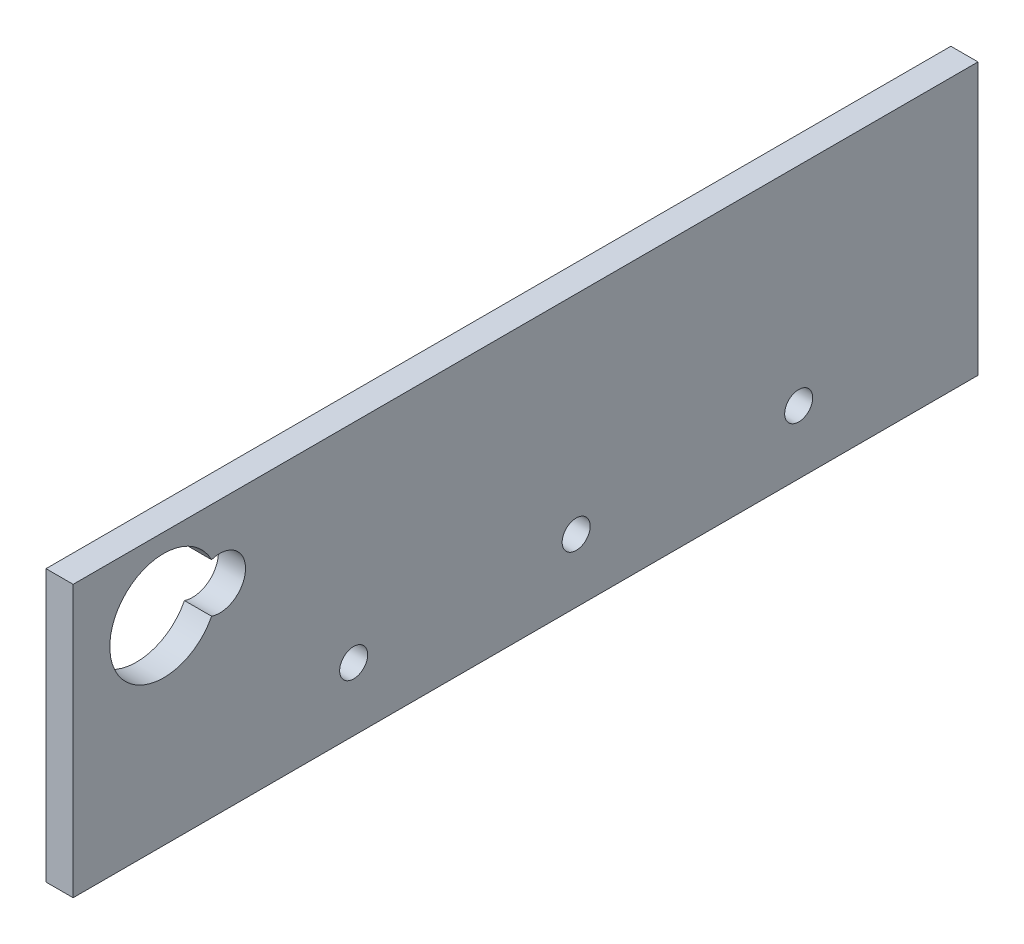
ISO-10303-21;
HEADER;
FILE_DESCRIPTION(('STEP AP214'),'2;1');
FILE_NAME('part.step','',(''),(''),'','','');
FILE_SCHEMA(('AUTOMOTIVE_DESIGN { 1 0 10303 214 1 1 1 1 }'));
ENDSEC;
DATA;
#1=APPLICATION_CONTEXT('core data for automotive mechanical design processes');
#2=APPLICATION_PROTOCOL_DEFINITION('international standard','automotive_design',2000,#1);
#3=PRODUCT_CONTEXT('',#1,'mechanical');
#4=PRODUCT('Part','Part','',(#3));
#5=PRODUCT_RELATED_PRODUCT_CATEGORY('part','',(#4));
#6=PRODUCT_DEFINITION_FORMATION('','',#4);
#7=PRODUCT_DEFINITION_CONTEXT('part definition',#1,'design');
#8=PRODUCT_DEFINITION('design','',#6,#7);
#9=PRODUCT_DEFINITION_SHAPE('','',#8);
#10=(LENGTH_UNIT() NAMED_UNIT(*) SI_UNIT(.MILLI.,.METRE.));
#11=(NAMED_UNIT(*) PLANE_ANGLE_UNIT() SI_UNIT($,.RADIAN.));
#12=(NAMED_UNIT(*) SI_UNIT($,.STERADIAN.) SOLID_ANGLE_UNIT());
#13=UNCERTAINTY_MEASURE_WITH_UNIT(LENGTH_MEASURE(1.E-05),#10,'distance_accuracy_value','');
#14=(GEOMETRIC_REPRESENTATION_CONTEXT(3) GLOBAL_UNCERTAINTY_ASSIGNED_CONTEXT((#13)) GLOBAL_UNIT_ASSIGNED_CONTEXT((#10,
#11,#12)) REPRESENTATION_CONTEXT('',''));
#15=CARTESIAN_POINT('',(0.,0.,0.));
#16=DIRECTION('',(0.,0.,1.));
#17=DIRECTION('',(1.,0.,0.));
#18=AXIS2_PLACEMENT_3D('',#15,#16,#17);
#19=CARTESIAN_POINT('',(3.,0.,0.));
#20=DIRECTION('',(0.,0.,-1.));
#21=DIRECTION('',(-1.,0.,0.));
#22=AXIS2_PLACEMENT_3D('',#19,#20,#21);
#23=PLANE('',#22);
#24=DIRECTION('',(0.,-1.,0.));
#25=VECTOR('',#24,1.);
#26=CARTESIAN_POINT('',(0.,0.,0.));
#27=LINE('',#26,#25);
#28=CARTESIAN_POINT('',(0.,30.,0.));
#29=VERTEX_POINT('',#28);
#30=CARTESIAN_POINT('',(0.,0.,0.));
#31=VERTEX_POINT('',#30);
#32=EDGE_CURVE('E119',#29,#31,#27,.T.);
#33=ORIENTED_EDGE('',*,*,#32,.T.);
#34=DIRECTION('',(-1.,0.,0.));
#35=VECTOR('',#34,1.);
#36=CARTESIAN_POINT('',(3.,0.,0.));
#37=LINE('',#36,#35);
#38=CARTESIAN_POINT('',(3.,0.,0.));
#39=VERTEX_POINT('',#38);
#40=EDGE_CURVE('E11',#39,#31,#37,.T.);
#41=ORIENTED_EDGE('',*,*,#40,.F.);
#42=DIRECTION('',(0.,-1.,0.));
#43=VECTOR('',#42,1.);
#44=CARTESIAN_POINT('',(3.,0.,0.));
#45=LINE('',#44,#43);
#46=CARTESIAN_POINT('',(3.,30.,0.));
#47=VERTEX_POINT('',#46);
#48=EDGE_CURVE('E139',#47,#39,#45,.T.);
#49=ORIENTED_EDGE('',*,*,#48,.F.);
#50=DIRECTION('',(-1.,0.,0.));
#51=VECTOR('',#50,1.);
#52=CARTESIAN_POINT('',(3.,30.,0.));
#53=LINE('',#52,#51);
#54=EDGE_CURVE('E153',#47,#29,#53,.T.);
#55=ORIENTED_EDGE('',*,*,#54,.T.);
#56=EDGE_LOOP('',(#33,#41,#49,#55));
#57=FACE_BOUND('',#56,.T.);
#58=ADVANCED_FACE('F39',(#57),#23,.F.);
#59=CARTESIAN_POINT('',(3.,0.,0.));
#60=DIRECTION('',(0.,1.,0.));
#61=DIRECTION('',(0.,0.,1.));
#62=AXIS2_PLACEMENT_3D('',#59,#60,#61);
#63=PLANE('',#62);
#64=DIRECTION('',(0.,0.,-1.));
#65=VECTOR('',#64,1.);
#66=CARTESIAN_POINT('',(0.,0.,0.));
#67=LINE('',#66,#65);
#68=CARTESIAN_POINT('',(0.,0.,-100.));
#69=VERTEX_POINT('',#68);
#70=EDGE_CURVE('E157',#31,#69,#67,.T.);
#71=ORIENTED_EDGE('',*,*,#70,.T.);
#72=DIRECTION('',(-1.,0.,0.));
#73=VECTOR('',#72,1.);
#74=CARTESIAN_POINT('',(3.,0.,-100.));
#75=LINE('',#74,#73);
#76=CARTESIAN_POINT('',(3.,0.,-100.));
#77=VERTEX_POINT('',#76);
#78=EDGE_CURVE('E47',#77,#69,#75,.T.);
#79=ORIENTED_EDGE('',*,*,#78,.F.);
#80=DIRECTION('',(0.,0.,-1.));
#81=VECTOR('',#80,1.);
#82=CARTESIAN_POINT('',(3.,0.,0.));
#83=LINE('',#82,#81);
#84=EDGE_CURVE('E143',#39,#77,#83,.T.);
#85=ORIENTED_EDGE('',*,*,#84,.F.);
#86=ORIENTED_EDGE('',*,*,#40,.T.);
#87=EDGE_LOOP('',(#71,#79,#85,#86));
#88=FACE_BOUND('',#87,.T.);
#89=ADVANCED_FACE('F192',(#88),#63,.F.);
#90=CARTESIAN_POINT('',(3.,0.,-100.));
#91=DIRECTION('',(0.,0.,1.));
#92=DIRECTION('',(1.,0.,0.));
#93=AXIS2_PLACEMENT_3D('',#90,#91,#92);
#94=PLANE('',#93);
#95=DIRECTION('',(0.,1.,0.));
#96=VECTOR('',#95,1.);
#97=CARTESIAN_POINT('',(0.,0.,-100.));
#98=LINE('',#97,#96);
#99=CARTESIAN_POINT('',(0.,30.,-100.));
#100=VERTEX_POINT('',#99);
#101=EDGE_CURVE('E160',#69,#100,#98,.T.);
#102=ORIENTED_EDGE('',*,*,#101,.T.);
#103=DIRECTION('',(-1.,0.,0.));
#104=VECTOR('',#103,1.);
#105=CARTESIAN_POINT('',(3.,30.,-100.));
#106=LINE('',#105,#104);
#107=CARTESIAN_POINT('',(3.,30.,-100.));
#108=VERTEX_POINT('',#107);
#109=EDGE_CURVE('E168',#108,#100,#106,.T.);
#110=ORIENTED_EDGE('',*,*,#109,.F.);
#111=DIRECTION('',(0.,1.,0.));
#112=VECTOR('',#111,1.);
#113=CARTESIAN_POINT('',(3.,0.,-100.));
#114=LINE('',#113,#112);
#115=EDGE_CURVE('E147',#77,#108,#114,.T.);
#116=ORIENTED_EDGE('',*,*,#115,.F.);
#117=ORIENTED_EDGE('',*,*,#78,.T.);
#118=EDGE_LOOP('',(#102,#110,#116,#117));
#119=FACE_BOUND('',#118,.T.);
#120=ADVANCED_FACE('F177',(#119),#94,.F.);
#121=CARTESIAN_POINT('',(3.,30.,0.));
#122=DIRECTION('',(0.,-1.,0.));
#123=DIRECTION('',(0.,0.,-1.));
#124=AXIS2_PLACEMENT_3D('',#121,#122,#123);
#125=PLANE('',#124);
#126=DIRECTION('',(0.,0.,1.));
#127=VECTOR('',#126,1.);
#128=CARTESIAN_POINT('',(0.,30.,0.));
#129=LINE('',#128,#127);
#130=EDGE_CURVE('E144',#100,#29,#129,.T.);
#131=ORIENTED_EDGE('',*,*,#130,.T.);
#132=ORIENTED_EDGE('',*,*,#54,.F.);
#133=DIRECTION('',(0.,0.,1.));
#134=VECTOR('',#133,1.);
#135=CARTESIAN_POINT('',(3.,30.,0.));
#136=LINE('',#135,#134);
#137=EDGE_CURVE('E150',#108,#47,#136,.T.);
#138=ORIENTED_EDGE('',*,*,#137,.F.);
#139=ORIENTED_EDGE('',*,*,#109,.T.);
#140=EDGE_LOOP('',(#131,#132,#138,#139));
#141=FACE_BOUND('',#140,.T.);
#142=ADVANCED_FACE('F185',(#141),#125,.F.);
#143=CARTESIAN_POINT('',(3.,0.,0.));
#144=DIRECTION('',(-1.,0.,0.));
#145=DIRECTION('',(0.,0.,1.));
#146=AXIS2_PLACEMENT_3D('',#143,#144,#145);
#147=PLANE('',#146);
#148=CARTESIAN_POINT('',(3.,22.,-10.));
#149=DIRECTION('',(-1.,0.,0.));
#150=DIRECTION('',(0.,0.,1.));
#151=AXIS2_PLACEMENT_3D('',#148,#149,#150);
#152=CIRCLE('',#151,5.95);
#153=CARTESIAN_POINT('',(3.,24.704163456598,-15.3));
#154=VERTEX_POINT('',#153);
#155=CARTESIAN_POINT('',(3.,19.295836543402,-15.3));
#156=VERTEX_POINT('',#155);
#157=EDGE_CURVE('E111',#154,#156,#152,.F.);
#158=ORIENTED_EDGE('',*,*,#157,.F.);
#159=CARTESIAN_POINT('',(3.,22.,-16.2));
#160=DIRECTION('',(-1.,0.,0.));
#161=DIRECTION('',(0.,0.,1.));
#162=AXIS2_PLACEMENT_3D('',#159,#160,#161);
#163=CIRCLE('',#162,2.85);
#164=EDGE_CURVE('E92',#156,#154,#163,.F.);
#165=ORIENTED_EDGE('',*,*,#164,.F.);
#166=EDGE_LOOP('',(#158,#165));
#167=FACE_BOUND('',#166,.T.);
#168=CARTESIAN_POINT('',(3.,7.,-31.));
#169=DIRECTION('',(1.,0.,0.));
#170=DIRECTION('',(0.,0.,-1.));
#171=AXIS2_PLACEMENT_3D('',#168,#169,#170);
#172=CIRCLE('',#171,1.54999999999999);
#173=CARTESIAN_POINT('',(3.,7.,-32.55));
#174=VERTEX_POINT('',#173);
#175=EDGE_CURVE('E120',#174,#174,#172,.T.);
#176=ORIENTED_EDGE('',*,*,#175,.F.);
#177=EDGE_LOOP('',(#176));
#178=FACE_BOUND('',#177,.T.);
#179=CARTESIAN_POINT('',(3.,7.,-55.5918746695755));
#180=DIRECTION('',(1.,0.,0.));
#181=DIRECTION('',(0.,0.,-1.));
#182=AXIS2_PLACEMENT_3D('',#179,#180,#181);
#183=CIRCLE('',#182,1.55);
#184=CARTESIAN_POINT('',(3.,7.,-57.1418746695755));
#185=VERTEX_POINT('',#184);
#186=EDGE_CURVE('E128',#185,#185,#183,.T.);
#187=ORIENTED_EDGE('',*,*,#186,.F.);
#188=EDGE_LOOP('',(#187));
#189=FACE_BOUND('',#188,.T.);
#190=CARTESIAN_POINT('',(3.,7.,-80.183749339151));
#191=DIRECTION('',(1.,0.,0.));
#192=DIRECTION('',(0.,0.,-1.));
#193=AXIS2_PLACEMENT_3D('',#190,#191,#192);
#194=CIRCLE('',#193,1.54999999999999);
#195=CARTESIAN_POINT('',(3.,7.,-81.733749339151));
#196=VERTEX_POINT('',#195);
#197=EDGE_CURVE('E114',#196,#196,#194,.T.);
#198=ORIENTED_EDGE('',*,*,#197,.F.);
#199=EDGE_LOOP('',(#198));
#200=FACE_BOUND('',#199,.T.);
#201=ORIENTED_EDGE('',*,*,#48,.T.);
#202=ORIENTED_EDGE('',*,*,#84,.T.);
#203=ORIENTED_EDGE('',*,*,#115,.T.);
#204=ORIENTED_EDGE('',*,*,#137,.T.);
#205=EDGE_LOOP('',(#201,#202,#203,#204));
#206=FACE_BOUND('',#205,.T.);
#207=ADVANCED_FACE('F191',(#167,#178,#189,#200,#206),#147,.F.);
#208=CARTESIAN_POINT('',(0.,0.,0.));
#209=DIRECTION('',(-1.,0.,0.));
#210=DIRECTION('',(0.,0.,1.));
#211=AXIS2_PLACEMENT_3D('',#208,#209,#210);
#212=PLANE('',#211);
#213=CARTESIAN_POINT('',(0.,22.,-16.2));
#214=DIRECTION('',(-1.,0.,0.));
#215=DIRECTION('',(0.,0.,1.));
#216=AXIS2_PLACEMENT_3D('',#213,#214,#215);
#217=CIRCLE('',#216,2.85);
#218=CARTESIAN_POINT('',(0.,24.704163456598,-15.3));
#219=VERTEX_POINT('',#218);
#220=CARTESIAN_POINT('',(0.,19.295836543402,-15.3));
#221=VERTEX_POINT('',#220);
#222=EDGE_CURVE('E61',#219,#221,#217,.T.);
#223=ORIENTED_EDGE('',*,*,#222,.F.);
#224=CARTESIAN_POINT('',(0.,22.,-10.));
#225=DIRECTION('',(-1.,0.,0.));
#226=DIRECTION('',(0.,0.,1.));
#227=AXIS2_PLACEMENT_3D('',#224,#225,#226);
#228=CIRCLE('',#227,5.95);
#229=EDGE_CURVE('E98',#221,#219,#228,.T.);
#230=ORIENTED_EDGE('',*,*,#229,.F.);
#231=EDGE_LOOP('',(#223,#230));
#232=FACE_BOUND('',#231,.T.);
#233=CARTESIAN_POINT('',(0.,7.,-31.));
#234=DIRECTION('',(1.,0.,0.));
#235=DIRECTION('',(0.,0.,-1.));
#236=AXIS2_PLACEMENT_3D('',#233,#234,#235);
#237=CIRCLE('',#236,1.54999999999999);
#238=CARTESIAN_POINT('',(0.,7.,-32.55));
#239=VERTEX_POINT('',#238);
#240=EDGE_CURVE('E115',#239,#239,#237,.T.);
#241=ORIENTED_EDGE('',*,*,#240,.T.);
#242=EDGE_LOOP('',(#241));
#243=FACE_BOUND('',#242,.T.);
#244=CARTESIAN_POINT('',(0.,7.,-55.5918746695755));
#245=DIRECTION('',(1.,0.,0.));
#246=DIRECTION('',(0.,0.,-1.));
#247=AXIS2_PLACEMENT_3D('',#244,#245,#246);
#248=CIRCLE('',#247,1.55);
#249=CARTESIAN_POINT('',(0.,7.,-57.1418746695755));
#250=VERTEX_POINT('',#249);
#251=EDGE_CURVE('E124',#250,#250,#248,.T.);
#252=ORIENTED_EDGE('',*,*,#251,.T.);
#253=EDGE_LOOP('',(#252));
#254=FACE_BOUND('',#253,.T.);
#255=CARTESIAN_POINT('',(0.,7.,-80.183749339151));
#256=DIRECTION('',(1.,0.,0.));
#257=DIRECTION('',(0.,0.,-1.));
#258=AXIS2_PLACEMENT_3D('',#255,#256,#257);
#259=CIRCLE('',#258,1.54999999999999);
#260=CARTESIAN_POINT('',(0.,7.,-81.733749339151));
#261=VERTEX_POINT('',#260);
#262=EDGE_CURVE('E132',#261,#261,#259,.T.);
#263=ORIENTED_EDGE('',*,*,#262,.T.);
#264=EDGE_LOOP('',(#263));
#265=FACE_BOUND('',#264,.T.);
#266=ORIENTED_EDGE('',*,*,#32,.F.);
#267=ORIENTED_EDGE('',*,*,#130,.F.);
#268=ORIENTED_EDGE('',*,*,#101,.F.);
#269=ORIENTED_EDGE('',*,*,#70,.F.);
#270=EDGE_LOOP('',(#266,#267,#268,#269));
#271=FACE_BOUND('',#270,.T.);
#272=ADVANCED_FACE('F103',(#232,#243,#254,#265,#271),#212,.T.);
#273=CARTESIAN_POINT('',(0.,7.,-80.183749339151));
#274=DIRECTION('',(1.,0.,0.));
#275=DIRECTION('',(0.,0.,-1.));
#276=AXIS2_PLACEMENT_3D('',#273,#274,#275);
#277=CYLINDRICAL_SURFACE('',#276,1.54999999999999);
#278=ORIENTED_EDGE('',*,*,#262,.F.);
#279=EDGE_LOOP('',(#278));
#280=FACE_BOUND('',#279,.T.);
#281=ORIENTED_EDGE('',*,*,#197,.T.);
#282=EDGE_LOOP('',(#281));
#283=FACE_BOUND('',#282,.T.);
#284=ADVANCED_FACE('F204',(#280,#283),#277,.F.);
#285=CARTESIAN_POINT('',(0.,7.,-55.5918746695755));
#286=DIRECTION('',(1.,0.,0.));
#287=DIRECTION('',(0.,0.,-1.));
#288=AXIS2_PLACEMENT_3D('',#285,#286,#287);
#289=CYLINDRICAL_SURFACE('',#288,1.55);
#290=ORIENTED_EDGE('',*,*,#251,.F.);
#291=EDGE_LOOP('',(#290));
#292=FACE_BOUND('',#291,.T.);
#293=ORIENTED_EDGE('',*,*,#186,.T.);
#294=EDGE_LOOP('',(#293));
#295=FACE_BOUND('',#294,.T.);
#296=ADVANCED_FACE('F210',(#292,#295),#289,.F.);
#297=CARTESIAN_POINT('',(0.,7.,-31.));
#298=DIRECTION('',(1.,0.,0.));
#299=DIRECTION('',(0.,0.,-1.));
#300=AXIS2_PLACEMENT_3D('',#297,#298,#299);
#301=CYLINDRICAL_SURFACE('',#300,1.54999999999999);
#302=ORIENTED_EDGE('',*,*,#240,.F.);
#303=EDGE_LOOP('',(#302));
#304=FACE_BOUND('',#303,.T.);
#305=ORIENTED_EDGE('',*,*,#175,.T.);
#306=EDGE_LOOP('',(#305));
#307=FACE_BOUND('',#306,.T.);
#308=ADVANCED_FACE('F214',(#304,#307),#301,.F.);
#309=CARTESIAN_POINT('',(22.147062437878,22.,-16.2));
#310=DIRECTION('',(-1.,0.,0.));
#311=DIRECTION('',(0.,0.,1.));
#312=AXIS2_PLACEMENT_3D('',#309,#310,#311);
#313=CYLINDRICAL_SURFACE('',#312,2.85);
#314=ORIENTED_EDGE('',*,*,#164,.T.);
#315=DIRECTION('',(-1.,0.,0.));
#316=VECTOR('',#315,1.);
#317=CARTESIAN_POINT('',(22.147062437878,24.704163456598,-15.3));
#318=LINE('',#317,#316);
#319=EDGE_CURVE('E54',#154,#219,#318,.T.);
#320=ORIENTED_EDGE('',*,*,#319,.T.);
#321=ORIENTED_EDGE('',*,*,#222,.T.);
#322=DIRECTION('',(-1.,0.,0.));
#323=VECTOR('',#322,1.);
#324=CARTESIAN_POINT('',(22.147062437878,19.295836543402,-15.3));
#325=LINE('',#324,#323);
#326=EDGE_CURVE('E95',#156,#221,#325,.T.);
#327=ORIENTED_EDGE('',*,*,#326,.F.);
#328=EDGE_LOOP('',(#314,#320,#321,#327));
#329=FACE_BOUND('',#328,.T.);
#330=ADVANCED_FACE('F90',(#329),#313,.F.);
#331=CARTESIAN_POINT('',(22.147062437878,22.,-10.));
#332=DIRECTION('',(-1.,0.,0.));
#333=DIRECTION('',(0.,0.,1.));
#334=AXIS2_PLACEMENT_3D('',#331,#332,#333);
#335=CYLINDRICAL_SURFACE('',#334,5.95);
#336=ORIENTED_EDGE('',*,*,#157,.T.);
#337=ORIENTED_EDGE('',*,*,#326,.T.);
#338=ORIENTED_EDGE('',*,*,#229,.T.);
#339=ORIENTED_EDGE('',*,*,#319,.F.);
#340=EDGE_LOOP('',(#336,#337,#338,#339));
#341=FACE_BOUND('',#340,.T.);
#342=ADVANCED_FACE('F99',(#341),#335,.F.);
#343=CLOSED_SHELL('',(#58,#89,#120,#142,#207,#272,#284,#296,#308,#330,#342));
#344=MANIFOLD_SOLID_BREP('B2',#343);
#345=ADVANCED_BREP_SHAPE_REPRESENTATION('',(#18,#344),#14);
#346=SHAPE_DEFINITION_REPRESENTATION(#9,#345);
ENDSEC;
END-ISO-10303-21;
